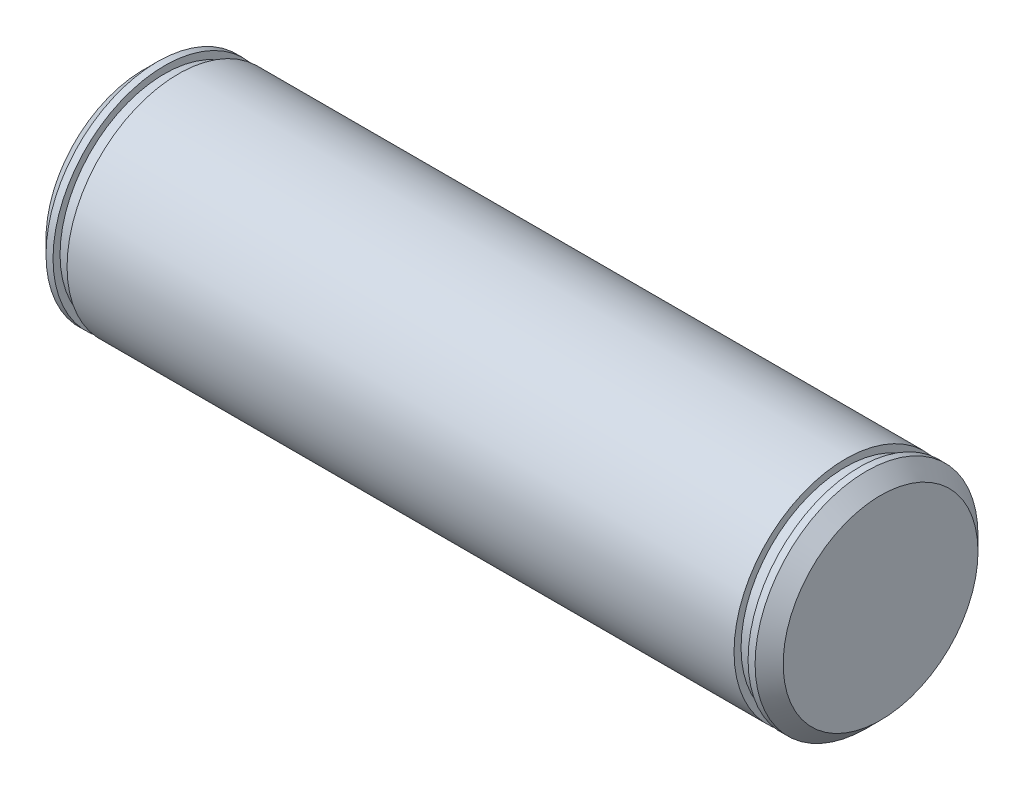
ISO-10303-21;
HEADER;
FILE_DESCRIPTION(('STEP AP214'),'2;1');
FILE_NAME('part.step','',(''),(''),'','','');
FILE_SCHEMA(('AUTOMOTIVE_DESIGN { 1 0 10303 214 1 1 1 1 }'));
ENDSEC;
DATA;
#1=APPLICATION_CONTEXT('core data for automotive mechanical design processes');
#2=APPLICATION_PROTOCOL_DEFINITION('international standard','automotive_design',2000,#1);
#3=PRODUCT_CONTEXT('',#1,'mechanical');
#4=PRODUCT('Part','Part','',(#3));
#5=PRODUCT_RELATED_PRODUCT_CATEGORY('part','',(#4));
#6=PRODUCT_DEFINITION_FORMATION('','',#4);
#7=PRODUCT_DEFINITION_CONTEXT('part definition',#1,'design');
#8=PRODUCT_DEFINITION('design','',#6,#7);
#9=PRODUCT_DEFINITION_SHAPE('','',#8);
#10=(LENGTH_UNIT() NAMED_UNIT(*) SI_UNIT(.MILLI.,.METRE.));
#11=(NAMED_UNIT(*) PLANE_ANGLE_UNIT() SI_UNIT($,.RADIAN.));
#12=(NAMED_UNIT(*) SI_UNIT($,.STERADIAN.) SOLID_ANGLE_UNIT());
#13=UNCERTAINTY_MEASURE_WITH_UNIT(LENGTH_MEASURE(1.E-05),#10,'distance_accuracy_value','');
#14=(GEOMETRIC_REPRESENTATION_CONTEXT(3) GLOBAL_UNCERTAINTY_ASSIGNED_CONTEXT((#13)) GLOBAL_UNIT_ASSIGNED_CONTEXT((#10,
#11,#12)) REPRESENTATION_CONTEXT('',''));
#15=CARTESIAN_POINT('',(0.,0.,0.));
#16=DIRECTION('',(0.,0.,1.));
#17=DIRECTION('',(1.,0.,0.));
#18=AXIS2_PLACEMENT_3D('',#15,#16,#17);
#19=CARTESIAN_POINT('',(52.5000000000002,0.,-2.22044604925031E-13));
#20=DIRECTION('',(-1.,0.,0.));
#21=DIRECTION('',(0.,0.,1.));
#22=AXIS2_PLACEMENT_3D('',#19,#20,#21);
#23=CYLINDRICAL_SURFACE('',#22,15.875);
#24=CARTESIAN_POINT('',(-47.5000000000003,-4.9960036108132E-13,6.66133814775094E-13));
#25=DIRECTION('',(-1.,0.,0.));
#26=DIRECTION('',(0.,0.,1.));
#27=AXIS2_PLACEMENT_3D('',#24,#25,#26);
#28=CIRCLE('',#27,15.875);
#29=CARTESIAN_POINT('',(-47.5000000000003,-5.00922220370015E-13,15.8750000000007));
#30=VERTEX_POINT('',#29);
#31=EDGE_CURVE('E76',#30,#30,#28,.T.);
#32=ORIENTED_EDGE('',*,*,#31,.F.);
#33=EDGE_LOOP('',(#32));
#34=FACE_BOUND('',#33,.T.);
#35=CARTESIAN_POINT('',(47.5000000000012,-3.88578058618805E-13,2.22044604925031E-13));
#36=DIRECTION('',(-1.,0.,0.));
#37=DIRECTION('',(0.,0.,1.));
#38=AXIS2_PLACEMENT_3D('',#35,#36,#37);
#39=CIRCLE('',#38,15.875);
#40=CARTESIAN_POINT('',(47.5000000000012,-3.89899917907499E-13,15.8750000000002));
#41=VERTEX_POINT('',#40);
#42=EDGE_CURVE('E92',#41,#41,#39,.T.);
#43=ORIENTED_EDGE('',*,*,#42,.T.);
#44=EDGE_LOOP('',(#43));
#45=FACE_BOUND('',#44,.T.);
#46=ADVANCED_FACE('F48',(#34,#45),#23,.T.);
#47=CARTESIAN_POINT('',(-49.4999999999997,0.,4.44089209850063E-13));
#48=DIRECTION('',(-1.,0.,0.));
#49=DIRECTION('',(0.,0.,1.));
#50=AXIS2_PLACEMENT_3D('',#47,#48,#49);
#51=CIRCLE('',#50,15.875);
#52=CARTESIAN_POINT('',(-49.4999999999997,0.,15.8750000000004));
#53=VERTEX_POINT('',#52);
#54=EDGE_CURVE('E75',#53,#53,#51,.T.);
#55=ORIENTED_EDGE('',*,*,#54,.T.);
#56=EDGE_LOOP('',(#55));
#57=FACE_BOUND('',#56,.T.);
#58=CARTESIAN_POINT('',(-50.4999999999987,1.66533453693773E-13,-2.22044604925031E-13));
#59=DIRECTION('',(1.,0.,0.));
#60=DIRECTION('',(0.,0.,-1.));
#61=AXIS2_PLACEMENT_3D('',#58,#59,#60);
#62=CIRCLE('',#61,15.875);
#63=CARTESIAN_POINT('',(-50.4999999999987,1.67855312982468E-13,-15.8750000000002));
#64=VERTEX_POINT('',#63);
#65=EDGE_CURVE('E63',#64,#64,#62,.T.);
#66=ORIENTED_EDGE('',*,*,#65,.T.);
#67=EDGE_LOOP('',(#66));
#68=FACE_BOUND('',#67,.T.);
#69=ADVANCED_FACE('F124',(#57,#68),#23,.T.);
#70=CARTESIAN_POINT('',(-52.4999999999984,1.11022302462516E-13,-4.44089209850063E-13));
#71=DIRECTION('',(1.,0.,0.));
#72=DIRECTION('',(0.,0.,-1.));
#73=AXIS2_PLACEMENT_3D('',#70,#71,#72);
#74=PLANE('',#73);
#75=CARTESIAN_POINT('',(-52.4999999999984,1.11022302462516E-13,-4.44089209850063E-13));
#76=DIRECTION('',(1.,0.,0.));
#77=DIRECTION('',(0.,0.,-1.));
#78=AXIS2_PLACEMENT_3D('',#75,#76,#77);
#79=CIRCLE('',#78,13.875);
#80=CARTESIAN_POINT('',(-52.4999999999984,1.12177628297516E-13,-13.8750000000004));
#81=VERTEX_POINT('',#80);
#82=EDGE_CURVE('E57',#81,#81,#79,.F.);
#83=ORIENTED_EDGE('',*,*,#82,.T.);
#84=EDGE_LOOP('',(#83));
#85=FACE_BOUND('',#84,.T.);
#86=ADVANCED_FACE('F139',(#85),#74,.F.);
#87=CARTESIAN_POINT('',(-50.4999999999987,1.66533453693773E-13,-2.22044604925031E-13));
#88=DIRECTION('',(1.,0.,0.));
#89=DIRECTION('',(0.,0.,-1.));
#90=AXIS2_PLACEMENT_3D('',#87,#88,#89);
#91=CONICAL_SURFACE('',#90,15.875,0.785398163397452);
#92=ORIENTED_EDGE('',*,*,#82,.F.);
#93=EDGE_LOOP('',(#92));
#94=FACE_BOUND('',#93,.T.);
#95=ORIENTED_EDGE('',*,*,#65,.F.);
#96=EDGE_LOOP('',(#95));
#97=FACE_BOUND('',#96,.T.);
#98=ADVANCED_FACE('F145',(#94,#97),#91,.T.);
#99=CARTESIAN_POINT('',(-49.4999999999997,0.,4.44089209850063E-13));
#100=DIRECTION('',(-1.,0.,0.));
#101=DIRECTION('',(0.,0.,1.));
#102=AXIS2_PLACEMENT_3D('',#99,#100,#101);
#103=PLANE('',#102);
#104=ORIENTED_EDGE('',*,*,#54,.F.);
#105=EDGE_LOOP('',(#104));
#106=FACE_BOUND('',#105,.T.);
#107=CARTESIAN_POINT('',(-49.4999999999997,0.,4.44089209850063E-13));
#108=DIRECTION('',(-1.,0.,0.));
#109=DIRECTION('',(0.,0.,1.));
#110=AXIS2_PLACEMENT_3D('',#107,#108,#109);
#111=CIRCLE('',#110,14.875);
#112=CARTESIAN_POINT('',(-49.4999999999997,0.,14.8750000000004));
#113=VERTEX_POINT('',#112);
#114=EDGE_CURVE('E80',#113,#113,#111,.T.);
#115=ORIENTED_EDGE('',*,*,#114,.T.);
#116=EDGE_LOOP('',(#115));
#117=FACE_BOUND('',#116,.T.);
#118=ADVANCED_FACE('F149',(#106,#117),#103,.F.);
#119=CARTESIAN_POINT('',(-47.5000000000003,-4.9960036108132E-13,6.66133814775094E-13));
#120=DIRECTION('',(-1.,0.,0.));
#121=DIRECTION('',(0.,0.,1.));
#122=AXIS2_PLACEMENT_3D('',#119,#120,#121);
#123=PLANE('',#122);
#124=ORIENTED_EDGE('',*,*,#31,.T.);
#125=EDGE_LOOP('',(#124));
#126=FACE_BOUND('',#125,.T.);
#127=CARTESIAN_POINT('',(-47.5000000000003,-4.9960036108132E-13,6.66133814775094E-13));
#128=DIRECTION('',(-1.,0.,0.));
#129=DIRECTION('',(0.,0.,1.));
#130=AXIS2_PLACEMENT_3D('',#127,#128,#129);
#131=CIRCLE('',#130,14.875);
#132=CARTESIAN_POINT('',(-47.5000000000003,-5.00838953643168E-13,14.8750000000007));
#133=VERTEX_POINT('',#132);
#134=EDGE_CURVE('E84',#133,#133,#131,.T.);
#135=ORIENTED_EDGE('',*,*,#134,.F.);
#136=EDGE_LOOP('',(#135));
#137=FACE_BOUND('',#136,.T.);
#138=ADVANCED_FACE('F155',(#126,#137),#123,.T.);
#139=CARTESIAN_POINT('',(-49.4999999999997,0.,4.44089209850063E-13));
#140=DIRECTION('',(1.,0.,0.));
#141=DIRECTION('',(0.,0.,-1.));
#142=AXIS2_PLACEMENT_3D('',#139,#140,#141);
#143=CYLINDRICAL_SURFACE('',#142,14.875);
#144=ORIENTED_EDGE('',*,*,#114,.F.);
#145=EDGE_LOOP('',(#144));
#146=FACE_BOUND('',#145,.T.);
#147=ORIENTED_EDGE('',*,*,#134,.T.);
#148=EDGE_LOOP('',(#147));
#149=FACE_BOUND('',#148,.T.);
#150=ADVANCED_FACE('F116',(#146,#149),#143,.T.);
#151=CARTESIAN_POINT('',(49.5000000000001,-1.66533453693773E-13,6.66133814775094E-13));
#152=DIRECTION('',(1.,0.,0.));
#153=DIRECTION('',(0.,0.,1.));
#154=AXIS2_PLACEMENT_3D('',#151,#152,#153);
#155=PLANE('',#154);
#156=CARTESIAN_POINT('',(49.5000000000001,-1.66533453693773E-13,6.66133814775094E-13));
#157=DIRECTION('',(-1.,0.,0.));
#158=DIRECTION('',(0.,0.,1.));
#159=AXIS2_PLACEMENT_3D('',#156,#157,#158);
#160=CIRCLE('',#159,14.875);
#161=CARTESIAN_POINT('',(49.5000000000001,-1.67772046255621E-13,14.8750000000007));
#162=VERTEX_POINT('',#161);
#163=EDGE_CURVE('E96',#162,#162,#160,.T.);
#164=ORIENTED_EDGE('',*,*,#163,.F.);
#165=EDGE_LOOP('',(#164));
#166=FACE_BOUND('',#165,.T.);
#167=CARTESIAN_POINT('',(49.5000000000001,-1.66533453693773E-13,6.66133814775094E-13));
#168=DIRECTION('',(-1.,0.,0.));
#169=DIRECTION('',(0.,0.,1.));
#170=AXIS2_PLACEMENT_3D('',#167,#168,#169);
#171=CIRCLE('',#170,15.875);
#172=CARTESIAN_POINT('',(49.5000000000001,-1.67855312982468E-13,15.8750000000007));
#173=VERTEX_POINT('',#172);
#174=EDGE_CURVE('E88',#173,#173,#171,.T.);
#175=ORIENTED_EDGE('',*,*,#174,.T.);
#176=EDGE_LOOP('',(#175));
#177=FACE_BOUND('',#176,.T.);
#178=ADVANCED_FACE('F112',(#166,#177),#155,.F.);
#179=CARTESIAN_POINT('',(47.5000000000012,-3.88578058618805E-13,2.22044604925031E-13));
#180=DIRECTION('',(1.,0.,0.));
#181=DIRECTION('',(0.,0.,1.));
#182=AXIS2_PLACEMENT_3D('',#179,#180,#181);
#183=PLANE('',#182);
#184=CARTESIAN_POINT('',(47.5000000000012,-3.88578058618805E-13,2.22044604925031E-13));
#185=DIRECTION('',(-1.,0.,0.));
#186=DIRECTION('',(0.,0.,1.));
#187=AXIS2_PLACEMENT_3D('',#184,#185,#186);
#188=CIRCLE('',#187,14.875);
#189=CARTESIAN_POINT('',(47.5000000000012,-3.89816651180652E-13,14.8750000000002));
#190=VERTEX_POINT('',#189);
#191=EDGE_CURVE('E100',#190,#190,#188,.T.);
#192=ORIENTED_EDGE('',*,*,#191,.T.);
#193=EDGE_LOOP('',(#192));
#194=FACE_BOUND('',#193,.T.);
#195=ORIENTED_EDGE('',*,*,#42,.F.);
#196=EDGE_LOOP('',(#195));
#197=FACE_BOUND('',#196,.T.);
#198=ADVANCED_FACE('F115',(#194,#197),#183,.T.);
#199=CARTESIAN_POINT('',(49.5000000000001,-1.66533453693773E-13,6.66133814775094E-13));
#200=DIRECTION('',(-1.,0.,0.));
#201=DIRECTION('',(0.,0.,1.));
#202=AXIS2_PLACEMENT_3D('',#199,#200,#201);
#203=CYLINDRICAL_SURFACE('',#202,14.875);
#204=ORIENTED_EDGE('',*,*,#163,.T.);
#205=EDGE_LOOP('',(#204));
#206=FACE_BOUND('',#205,.T.);
#207=ORIENTED_EDGE('',*,*,#191,.F.);
#208=EDGE_LOOP('',(#207));
#209=FACE_BOUND('',#208,.T.);
#210=ADVANCED_FACE('F109',(#206,#209),#203,.T.);
#211=CARTESIAN_POINT('',(52.5000000000002,0.,-2.22044604925031E-13));
#212=DIRECTION('',(1.,0.,0.));
#213=DIRECTION('',(0.,0.,-1.));
#214=AXIS2_PLACEMENT_3D('',#211,#212,#213);
#215=PLANE('',#214);
#216=CARTESIAN_POINT('',(52.5000000000002,0.,-2.22044604925031E-13));
#217=DIRECTION('',(1.,0.,0.));
#218=DIRECTION('',(0.,0.,-1.));
#219=AXIS2_PLACEMENT_3D('',#216,#217,#218);
#220=CIRCLE('',#219,13.875);
#221=CARTESIAN_POINT('',(52.5000000000002,0.,-13.8750000000002));
#222=VERTEX_POINT('',#221);
#223=EDGE_CURVE('E12',#222,#222,#220,.T.);
#224=ORIENTED_EDGE('',*,*,#223,.T.);
#225=EDGE_LOOP('',(#224));
#226=FACE_BOUND('',#225,.T.);
#227=ADVANCED_FACE('F129',(#226),#215,.T.);
#228=CARTESIAN_POINT('',(52.5000000000002,0.,-2.22044604925031E-13));
#229=DIRECTION('',(-1.,0.,0.));
#230=DIRECTION('',(0.,0.,1.));
#231=AXIS2_PLACEMENT_3D('',#228,#229,#230);
#232=CONICAL_SURFACE('',#231,13.875,0.785398163397443);
#233=CARTESIAN_POINT('',(50.500000000002,-1.11022302462516E-13,2.22044604925031E-13));
#234=DIRECTION('',(1.,0.,0.));
#235=DIRECTION('',(0.,0.,-1.));
#236=AXIS2_PLACEMENT_3D('',#233,#234,#235);
#237=CIRCLE('',#236,15.875);
#238=CARTESIAN_POINT('',(50.500000000002,-1.09700443173821E-13,-15.8749999999998));
#239=VERTEX_POINT('',#238);
#240=EDGE_CURVE('E69',#239,#239,#237,.F.);
#241=ORIENTED_EDGE('',*,*,#240,.F.);
#242=EDGE_LOOP('',(#241));
#243=FACE_BOUND('',#242,.T.);
#244=ORIENTED_EDGE('',*,*,#223,.F.);
#245=EDGE_LOOP('',(#244));
#246=FACE_BOUND('',#245,.T.);
#247=ADVANCED_FACE('F51',(#243,#246),#232,.T.);
#248=ORIENTED_EDGE('',*,*,#174,.F.);
#249=EDGE_LOOP('',(#248));
#250=FACE_BOUND('',#249,.T.);
#251=ORIENTED_EDGE('',*,*,#240,.T.);
#252=EDGE_LOOP('',(#251));
#253=FACE_BOUND('',#252,.T.);
#254=ADVANCED_FACE('F120',(#250,#253),#23,.T.);
#255=CLOSED_SHELL('',(#46,#69,#86,#98,#118,#138,#150,#178,#198,#210,#227,#247,#254));
#256=MANIFOLD_SOLID_BREP('B2',#255);
#257=ADVANCED_BREP_SHAPE_REPRESENTATION('',(#18,#256),#14);
#258=SHAPE_DEFINITION_REPRESENTATION(#9,#257);
ENDSEC;
END-ISO-10303-21;
